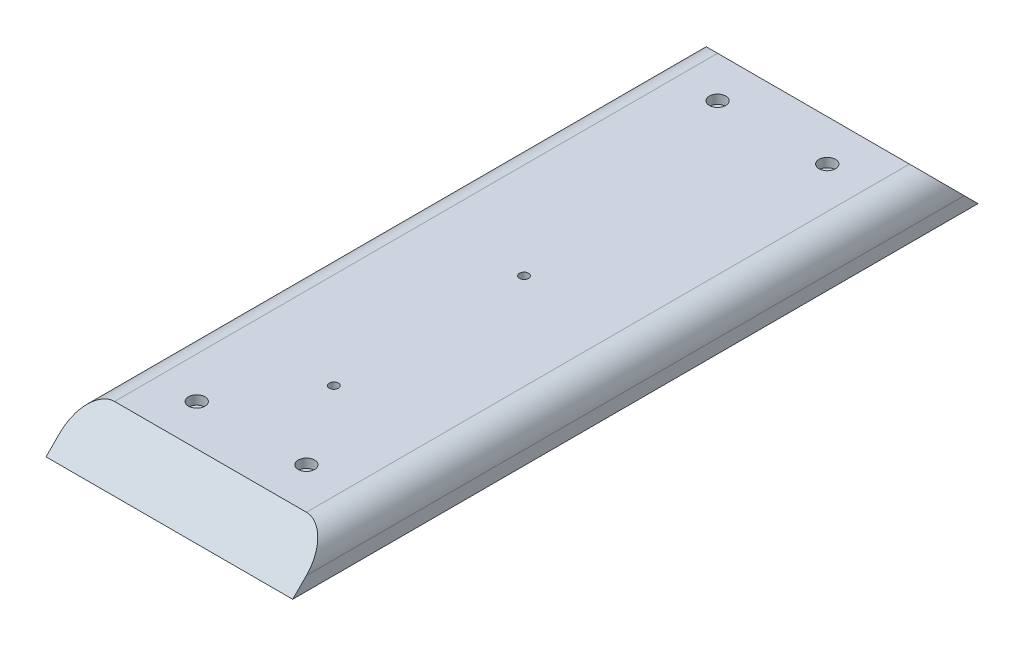
ISO-10303-21;
HEADER;
FILE_DESCRIPTION(('STEP AP214'),'2;1');
FILE_NAME('part.step','',(''),(''),'','','');
FILE_SCHEMA(('AUTOMOTIVE_DESIGN { 1 0 10303 214 1 1 1 1 }'));
ENDSEC;
DATA;
#1=APPLICATION_CONTEXT('core data for automotive mechanical design processes');
#2=APPLICATION_PROTOCOL_DEFINITION('international standard','automotive_design',2000,#1);
#3=PRODUCT_CONTEXT('',#1,'mechanical');
#4=PRODUCT('Part','Part','',(#3));
#5=PRODUCT_RELATED_PRODUCT_CATEGORY('part','',(#4));
#6=PRODUCT_DEFINITION_FORMATION('','',#4);
#7=PRODUCT_DEFINITION_CONTEXT('part definition',#1,'design');
#8=PRODUCT_DEFINITION('design','',#6,#7);
#9=PRODUCT_DEFINITION_SHAPE('','',#8);
#10=(LENGTH_UNIT() NAMED_UNIT(*) SI_UNIT(.MILLI.,.METRE.));
#11=(NAMED_UNIT(*) PLANE_ANGLE_UNIT() SI_UNIT($,.RADIAN.));
#12=(NAMED_UNIT(*) SI_UNIT($,.STERADIAN.) SOLID_ANGLE_UNIT());
#13=UNCERTAINTY_MEASURE_WITH_UNIT(LENGTH_MEASURE(1.E-05),#10,'distance_accuracy_value','');
#14=(GEOMETRIC_REPRESENTATION_CONTEXT(3) GLOBAL_UNCERTAINTY_ASSIGNED_CONTEXT((#13)) GLOBAL_UNIT_ASSIGNED_CONTEXT((#10,
#11,#12)) REPRESENTATION_CONTEXT('',''));
#15=CARTESIAN_POINT('',(0.,0.,0.));
#16=DIRECTION('',(0.,0.,1.));
#17=DIRECTION('',(1.,0.,0.));
#18=AXIS2_PLACEMENT_3D('',#15,#16,#17);
#19=CARTESIAN_POINT('',(45.,0.,-129.4));
#20=DIRECTION('',(0.,1.,0.));
#21=DIRECTION('',(0.,0.,1.));
#22=AXIS2_PLACEMENT_3D('',#19,#20,#21);
#23=CYLINDRICAL_SURFACE('',#22,1.65);
#24=CARTESIAN_POINT('',(45.,15.,-129.4));
#25=DIRECTION('',(0.,1.,0.));
#26=DIRECTION('',(0.,0.,1.));
#27=AXIS2_PLACEMENT_3D('',#24,#25,#26);
#28=CIRCLE('',#27,1.65);
#29=CARTESIAN_POINT('',(45.,15.,-127.75));
#30=VERTEX_POINT('',#29);
#31=EDGE_CURVE('E275',#30,#30,#28,.T.);
#32=ORIENTED_EDGE('',*,*,#31,.T.);
#33=EDGE_LOOP('',(#32));
#34=FACE_BOUND('',#33,.T.);
#35=CARTESIAN_POINT('',(45.,10.,-129.4));
#36=DIRECTION('',(0.,-1.,0.));
#37=DIRECTION('',(0.,0.,-1.));
#38=AXIS2_PLACEMENT_3D('',#35,#36,#37);
#39=CIRCLE('',#38,1.65);
#40=CARTESIAN_POINT('',(45.,10.,-131.05));
#41=VERTEX_POINT('',#40);
#42=EDGE_CURVE('E47',#41,#41,#39,.F.);
#43=ORIENTED_EDGE('',*,*,#42,.F.);
#44=EDGE_LOOP('',(#43));
#45=FACE_BOUND('',#44,.T.);
#46=ADVANCED_FACE('F43',(#34,#45),#23,.F.);
#47=CARTESIAN_POINT('',(45.,0.,-60.));
#48=DIRECTION('',(0.,1.,0.));
#49=DIRECTION('',(0.,0.,1.));
#50=AXIS2_PLACEMENT_3D('',#47,#48,#49);
#51=CYLINDRICAL_SURFACE('',#50,1.65);
#52=CARTESIAN_POINT('',(45.,15.,-60.));
#53=DIRECTION('',(0.,1.,0.));
#54=DIRECTION('',(0.,0.,1.));
#55=AXIS2_PLACEMENT_3D('',#52,#53,#54);
#56=CIRCLE('',#55,1.65);
#57=CARTESIAN_POINT('',(45.,15.,-58.35));
#58=VERTEX_POINT('',#57);
#59=EDGE_CURVE('E271',#58,#58,#56,.T.);
#60=ORIENTED_EDGE('',*,*,#59,.T.);
#61=EDGE_LOOP('',(#60));
#62=FACE_BOUND('',#61,.T.);
#63=CARTESIAN_POINT('',(45.,10.,-60.));
#64=DIRECTION('',(0.,-1.,0.));
#65=DIRECTION('',(0.,0.,-1.));
#66=AXIS2_PLACEMENT_3D('',#63,#64,#65);
#67=CIRCLE('',#66,1.65);
#68=CARTESIAN_POINT('',(45.,10.,-61.65));
#69=VERTEX_POINT('',#68);
#70=EDGE_CURVE('E217',#69,#69,#67,.F.);
#71=ORIENTED_EDGE('',*,*,#70,.F.);
#72=EDGE_LOOP('',(#71));
#73=FACE_BOUND('',#72,.T.);
#74=ADVANCED_FACE('F374',(#62,#73),#51,.F.);
#75=CARTESIAN_POINT('',(25.,0.,-30.));
#76=DIRECTION('',(0.,1.,0.));
#77=DIRECTION('',(0.,0.,1.));
#78=AXIS2_PLACEMENT_3D('',#75,#76,#77);
#79=CYLINDRICAL_SURFACE('',#78,1.65);
#80=CARTESIAN_POINT('',(25.,0.,-30.));
#81=DIRECTION('',(0.,1.,0.));
#82=DIRECTION('',(0.,0.,1.));
#83=AXIS2_PLACEMENT_3D('',#80,#81,#82);
#84=CIRCLE('',#83,1.65);
#85=CARTESIAN_POINT('',(25.,0.,-28.35));
#86=VERTEX_POINT('',#85);
#87=EDGE_CURVE('E305',#86,#86,#84,.T.);
#88=ORIENTED_EDGE('',*,*,#87,.F.);
#89=EDGE_LOOP('',(#88));
#90=FACE_BOUND('',#89,.T.);
#91=CARTESIAN_POINT('',(25.,11.7,-30.));
#92=DIRECTION('',(0.,1.,0.));
#93=DIRECTION('',(0.,0.,1.));
#94=AXIS2_PLACEMENT_3D('',#91,#92,#93);
#95=CIRCLE('',#94,1.65);
#96=CARTESIAN_POINT('',(25.,11.7,-28.35));
#97=VERTEX_POINT('',#96);
#98=EDGE_CURVE('E312',#97,#97,#95,.F.);
#99=ORIENTED_EDGE('',*,*,#98,.F.);
#100=EDGE_LOOP('',(#99));
#101=FACE_BOUND('',#100,.T.);
#102=ADVANCED_FACE('F381',(#90,#101),#79,.F.);
#103=CARTESIAN_POINT('',(65.,0.,-30.));
#104=DIRECTION('',(0.,1.,0.));
#105=DIRECTION('',(0.,0.,1.));
#106=AXIS2_PLACEMENT_3D('',#103,#104,#105);
#107=CYLINDRICAL_SURFACE('',#106,1.65);
#108=CARTESIAN_POINT('',(65.,0.,-30.));
#109=DIRECTION('',(0.,1.,0.));
#110=DIRECTION('',(0.,0.,1.));
#111=AXIS2_PLACEMENT_3D('',#108,#109,#110);
#112=CIRCLE('',#111,1.65);
#113=CARTESIAN_POINT('',(65.,0.,-28.35));
#114=VERTEX_POINT('',#113);
#115=EDGE_CURVE('E302',#114,#114,#112,.T.);
#116=ORIENTED_EDGE('',*,*,#115,.F.);
#117=EDGE_LOOP('',(#116));
#118=FACE_BOUND('',#117,.T.);
#119=CARTESIAN_POINT('',(65.,11.7,-30.));
#120=DIRECTION('',(0.,1.,0.));
#121=DIRECTION('',(0.,0.,1.));
#122=AXIS2_PLACEMENT_3D('',#119,#120,#121);
#123=CIRCLE('',#122,1.65);
#124=CARTESIAN_POINT('',(65.,11.7,-28.35));
#125=VERTEX_POINT('',#124);
#126=EDGE_CURVE('E362',#125,#125,#123,.F.);
#127=ORIENTED_EDGE('',*,*,#126,.F.);
#128=EDGE_LOOP('',(#127));
#129=FACE_BOUND('',#128,.T.);
#130=ADVANCED_FACE('F419',(#118,#129),#107,.F.);
#131=CARTESIAN_POINT('',(0.,15.,0.));
#132=DIRECTION('',(1.,0.,0.));
#133=DIRECTION('',(0.,0.,-1.));
#134=AXIS2_PLACEMENT_3D('',#131,#132,#133);
#135=PLANE('',#134);
#136=DIRECTION('',(0.,-0.707106781186549,0.707106781186546));
#137=VECTOR('',#136,1.);
#138=CARTESIAN_POINT('',(0.,15.,-15.));
#139=LINE('',#138,#137);
#140=CARTESIAN_POINT('',(0.,0.,0.));
#141=VERTEX_POINT('',#140);
#142=CARTESIAN_POINT('',(0.,5.,-4.99999999999999));
#143=VERTEX_POINT('',#142);
#144=EDGE_CURVE('E332',#141,#143,#139,.F.);
#145=ORIENTED_EDGE('',*,*,#144,.T.);
#146=DIRECTION('',(0.,0.,1.));
#147=VECTOR('',#146,1.);
#148=CARTESIAN_POINT('',(0.,5.,0.));
#149=LINE('',#148,#147);
#150=CARTESIAN_POINT('',(0.,5.,-245.));
#151=VERTEX_POINT('',#150);
#152=EDGE_CURVE('E352',#143,#151,#149,.F.);
#153=ORIENTED_EDGE('',*,*,#152,.T.);
#154=DIRECTION('',(0.,0.707106781186549,0.707106781186546));
#155=VECTOR('',#154,1.);
#156=CARTESIAN_POINT('',(0.,15.,-235.));
#157=LINE('',#156,#155);
#158=CARTESIAN_POINT('',(0.,0.,-250.));
#159=VERTEX_POINT('',#158);
#160=EDGE_CURVE('E335',#151,#159,#157,.F.);
#161=ORIENTED_EDGE('',*,*,#160,.T.);
#162=DIRECTION('',(0.,0.,1.));
#163=VECTOR('',#162,1.);
#164=CARTESIAN_POINT('',(0.,0.,0.));
#165=LINE('',#164,#163);
#166=EDGE_CURVE('E315',#159,#141,#165,.T.);
#167=ORIENTED_EDGE('',*,*,#166,.T.);
#168=EDGE_LOOP('',(#145,#153,#161,#167));
#169=FACE_BOUND('',#168,.T.);
#170=ADVANCED_FACE('F422',(#169),#135,.F.);
#171=CARTESIAN_POINT('',(90.,15.,0.));
#172=DIRECTION('',(-1.,0.,0.));
#173=DIRECTION('',(0.,0.,1.));
#174=AXIS2_PLACEMENT_3D('',#171,#172,#173);
#175=PLANE('',#174);
#176=DIRECTION('',(0.,-0.707106781186549,-0.707106781186546));
#177=VECTOR('',#176,1.);
#178=CARTESIAN_POINT('',(90.,15.,-235.));
#179=LINE('',#178,#177);
#180=CARTESIAN_POINT('',(90.,0.,-250.));
#181=VERTEX_POINT('',#180);
#182=CARTESIAN_POINT('',(90.,5.,-245.));
#183=VERTEX_POINT('',#182);
#184=EDGE_CURVE('E339',#181,#183,#179,.F.);
#185=ORIENTED_EDGE('',*,*,#184,.T.);
#186=DIRECTION('',(0.,0.,-1.));
#187=VECTOR('',#186,1.);
#188=CARTESIAN_POINT('',(90.,5.,0.));
#189=LINE('',#188,#187);
#190=CARTESIAN_POINT('',(90.,5.,-4.99999999999999));
#191=VERTEX_POINT('',#190);
#192=EDGE_CURVE('E11',#183,#191,#189,.F.);
#193=ORIENTED_EDGE('',*,*,#192,.T.);
#194=DIRECTION('',(0.,0.707106781186549,-0.707106781186546));
#195=VECTOR('',#194,1.);
#196=CARTESIAN_POINT('',(90.,15.,-15.));
#197=LINE('',#196,#195);
#198=CARTESIAN_POINT('',(90.,0.,0.));
#199=VERTEX_POINT('',#198);
#200=EDGE_CURVE('E337',#191,#199,#197,.F.);
#201=ORIENTED_EDGE('',*,*,#200,.T.);
#202=DIRECTION('',(0.,0.,-1.));
#203=VECTOR('',#202,1.);
#204=CARTESIAN_POINT('',(90.,0.,0.));
#205=LINE('',#204,#203);
#206=EDGE_CURVE('E321',#199,#181,#205,.T.);
#207=ORIENTED_EDGE('',*,*,#206,.T.);
#208=EDGE_LOOP('',(#185,#193,#201,#207));
#209=FACE_BOUND('',#208,.T.);
#210=ADVANCED_FACE('F437',(#209),#175,.F.);
#211=CARTESIAN_POINT('',(0.,15.,0.));
#212=DIRECTION('',(0.,-1.,0.));
#213=DIRECTION('',(0.,0.,-1.));
#214=AXIS2_PLACEMENT_3D('',#211,#212,#213);
#215=PLANE('',#214);
#216=ORIENTED_EDGE('',*,*,#59,.F.);
#217=EDGE_LOOP('',(#216));
#218=FACE_BOUND('',#217,.T.);
#219=ORIENTED_EDGE('',*,*,#31,.F.);
#220=EDGE_LOOP('',(#219));
#221=FACE_BOUND('',#220,.T.);
#222=CARTESIAN_POINT('',(25.,15.,-220.));
#223=DIRECTION('',(0.,1.,0.));
#224=DIRECTION('',(0.,0.,-1.));
#225=AXIS2_PLACEMENT_3D('',#222,#223,#224);
#226=CIRCLE('',#225,3.);
#227=CARTESIAN_POINT('',(25.,15.,-223.));
#228=VERTEX_POINT('',#227);
#229=EDGE_CURVE('E291',#228,#228,#226,.T.);
#230=ORIENTED_EDGE('',*,*,#229,.F.);
#231=EDGE_LOOP('',(#230));
#232=FACE_BOUND('',#231,.T.);
#233=CARTESIAN_POINT('',(64.9999999999999,15.,-220.));
#234=DIRECTION('',(0.,1.,0.));
#235=DIRECTION('',(0.,0.,-1.));
#236=AXIS2_PLACEMENT_3D('',#233,#234,#235);
#237=CIRCLE('',#236,3.00000000000001);
#238=CARTESIAN_POINT('',(64.9999999999999,15.,-223.));
#239=VERTEX_POINT('',#238);
#240=EDGE_CURVE('E285',#239,#239,#237,.T.);
#241=ORIENTED_EDGE('',*,*,#240,.F.);
#242=EDGE_LOOP('',(#241));
#243=FACE_BOUND('',#242,.T.);
#244=CARTESIAN_POINT('',(65.,15.,-30.));
#245=DIRECTION('',(0.,1.,0.));
#246=DIRECTION('',(0.,0.,1.));
#247=AXIS2_PLACEMENT_3D('',#244,#245,#246);
#248=CIRCLE('',#247,3.00000000000001);
#249=CARTESIAN_POINT('',(65.,15.,-27.));
#250=VERTEX_POINT('',#249);
#251=EDGE_CURVE('E278',#250,#250,#248,.T.);
#252=ORIENTED_EDGE('',*,*,#251,.F.);
#253=EDGE_LOOP('',(#252));
#254=FACE_BOUND('',#253,.T.);
#255=CARTESIAN_POINT('',(25.,15.,-30.));
#256=DIRECTION('',(0.,1.,0.));
#257=DIRECTION('',(0.,0.,1.));
#258=AXIS2_PLACEMENT_3D('',#255,#256,#257);
#259=CIRCLE('',#258,3.);
#260=CARTESIAN_POINT('',(25.,15.,-27.));
#261=VERTEX_POINT('',#260);
#262=EDGE_CURVE('E281',#261,#261,#259,.T.);
#263=ORIENTED_EDGE('',*,*,#262,.F.);
#264=EDGE_LOOP('',(#263));
#265=FACE_BOUND('',#264,.T.);
#266=DIRECTION('',(-1.,0.,0.));
#267=VECTOR('',#266,1.);
#268=CARTESIAN_POINT('',(0.,15.,-235.));
#269=LINE('',#268,#267);
#270=CARTESIAN_POINT('',(80.,15.,-235.));
#271=VERTEX_POINT('',#270);
#272=CARTESIAN_POINT('',(10.,15.,-235.));
#273=VERTEX_POINT('',#272);
#274=EDGE_CURVE('E329',#271,#273,#269,.T.);
#275=ORIENTED_EDGE('',*,*,#274,.T.);
#276=DIRECTION('',(0.,0.,1.));
#277=VECTOR('',#276,1.);
#278=CARTESIAN_POINT('',(10.,15.,0.));
#279=LINE('',#278,#277);
#280=CARTESIAN_POINT('',(10.,15.,-15.));
#281=VERTEX_POINT('',#280);
#282=EDGE_CURVE('E345',#273,#281,#279,.T.);
#283=ORIENTED_EDGE('',*,*,#282,.T.);
#284=DIRECTION('',(1.,0.,0.));
#285=VECTOR('',#284,1.);
#286=CARTESIAN_POINT('',(0.,15.,-15.));
#287=LINE('',#286,#285);
#288=CARTESIAN_POINT('',(80.,15.,-15.));
#289=VERTEX_POINT('',#288);
#290=EDGE_CURVE('E326',#281,#289,#287,.T.);
#291=ORIENTED_EDGE('',*,*,#290,.T.);
#292=DIRECTION('',(0.,0.,-1.));
#293=VECTOR('',#292,1.);
#294=CARTESIAN_POINT('',(80.,15.,0.));
#295=LINE('',#294,#293);
#296=EDGE_CURVE('E342',#289,#271,#295,.T.);
#297=ORIENTED_EDGE('',*,*,#296,.T.);
#298=EDGE_LOOP('',(#275,#283,#291,#297));
#299=FACE_BOUND('',#298,.T.);
#300=ADVANCED_FACE('F434',(#218,#221,#232,#243,#254,#265,#299),#215,.F.);
#301=CARTESIAN_POINT('',(0.,0.,0.));
#302=DIRECTION('',(0.,-1.,0.));
#303=DIRECTION('',(0.,0.,-1.));
#304=AXIS2_PLACEMENT_3D('',#301,#302,#303);
#305=PLANE('',#304);
#306=DIRECTION('',(0.499999999999999,0.,0.866025403784439));
#307=VECTOR('',#306,1.);
#308=CARTESIAN_POINT('',(46.6165807537309,0.,-62.8));
#309=LINE('',#308,#307);
#310=CARTESIAN_POINT('',(46.6165807537309,0.,-62.8));
#311=VERTEX_POINT('',#310);
#312=CARTESIAN_POINT('',(48.2331615074619,0.,-60.));
#313=VERTEX_POINT('',#312);
#314=EDGE_CURVE('E60',#311,#313,#309,.T.);
#315=ORIENTED_EDGE('',*,*,#314,.F.);
#316=DIRECTION('',(1.,0.,0.));
#317=VECTOR('',#316,1.);
#318=CARTESIAN_POINT('',(43.383419246269,0.,-62.8));
#319=LINE('',#318,#317);
#320=CARTESIAN_POINT('',(43.383419246269,0.,-62.8));
#321=VERTEX_POINT('',#320);
#322=EDGE_CURVE('E191',#321,#311,#319,.T.);
#323=ORIENTED_EDGE('',*,*,#322,.F.);
#324=DIRECTION('',(0.5,0.,-0.866025403784439));
#325=VECTOR('',#324,1.);
#326=CARTESIAN_POINT('',(41.7668384925381,0.,-60.));
#327=LINE('',#326,#325);
#328=CARTESIAN_POINT('',(41.7668384925381,0.,-60.));
#329=VERTEX_POINT('',#328);
#330=EDGE_CURVE('E194',#329,#321,#327,.T.);
#331=ORIENTED_EDGE('',*,*,#330,.F.);
#332=DIRECTION('',(-0.5,0.,-0.866025403784439));
#333=VECTOR('',#332,1.);
#334=CARTESIAN_POINT('',(43.383419246269,0.,-57.2));
#335=LINE('',#334,#333);
#336=CARTESIAN_POINT('',(43.383419246269,0.,-57.2));
#337=VERTEX_POINT('',#336);
#338=EDGE_CURVE('E210',#337,#329,#335,.T.);
#339=ORIENTED_EDGE('',*,*,#338,.F.);
#340=DIRECTION('',(-1.,0.,0.));
#341=VECTOR('',#340,1.);
#342=CARTESIAN_POINT('',(46.6165807537309,0.,-57.2));
#343=LINE('',#342,#341);
#344=CARTESIAN_POINT('',(46.6165807537309,0.,-57.2));
#345=VERTEX_POINT('',#344);
#346=EDGE_CURVE('E207',#345,#337,#343,.T.);
#347=ORIENTED_EDGE('',*,*,#346,.F.);
#348=DIRECTION('',(-0.5,0.,0.866025403784438));
#349=VECTOR('',#348,1.);
#350=CARTESIAN_POINT('',(48.2331615074619,0.,-60.));
#351=LINE('',#350,#349);
#352=EDGE_CURVE('E205',#313,#345,#351,.T.);
#353=ORIENTED_EDGE('',*,*,#352,.F.);
#354=EDGE_LOOP('',(#315,#323,#331,#339,#347,#353));
#355=FACE_BOUND('',#354,.T.);
#356=DIRECTION('',(0.499999999999998,0.,0.86602540378444));
#357=VECTOR('',#356,1.);
#358=CARTESIAN_POINT('',(46.616580753731,0.,-132.2));
#359=LINE('',#358,#357);
#360=CARTESIAN_POINT('',(46.616580753731,0.,-132.2));
#361=VERTEX_POINT('',#360);
#362=CARTESIAN_POINT('',(48.2331615074619,0.,-129.4));
#363=VERTEX_POINT('',#362);
#364=EDGE_CURVE('E68',#361,#363,#359,.T.);
#365=ORIENTED_EDGE('',*,*,#364,.F.);
#366=DIRECTION('',(1.,0.,0.));
#367=VECTOR('',#366,1.);
#368=CARTESIAN_POINT('',(43.3834192462691,0.,-132.2));
#369=LINE('',#368,#367);
#370=CARTESIAN_POINT('',(43.3834192462691,0.,-132.2));
#371=VERTEX_POINT('',#370);
#372=EDGE_CURVE('E238',#371,#361,#369,.T.);
#373=ORIENTED_EDGE('',*,*,#372,.F.);
#374=DIRECTION('',(0.500000000000001,0.,-0.866025403784438));
#375=VECTOR('',#374,1.);
#376=CARTESIAN_POINT('',(41.7668384925381,0.,-129.4));
#377=LINE('',#376,#375);
#378=CARTESIAN_POINT('',(41.7668384925381,0.,-129.4));
#379=VERTEX_POINT('',#378);
#380=EDGE_CURVE('E241',#379,#371,#377,.T.);
#381=ORIENTED_EDGE('',*,*,#380,.F.);
#382=DIRECTION('',(-0.5,0.,-0.866025403784438));
#383=VECTOR('',#382,1.);
#384=CARTESIAN_POINT('',(43.3834192462691,0.,-126.6));
#385=LINE('',#384,#383);
#386=CARTESIAN_POINT('',(43.3834192462691,0.,-126.6));
#387=VERTEX_POINT('',#386);
#388=EDGE_CURVE('E245',#387,#379,#385,.T.);
#389=ORIENTED_EDGE('',*,*,#388,.F.);
#390=DIRECTION('',(-1.,0.,0.));
#391=VECTOR('',#390,1.);
#392=CARTESIAN_POINT('',(46.616580753731,0.,-126.6));
#393=LINE('',#392,#391);
#394=CARTESIAN_POINT('',(46.616580753731,0.,-126.6));
#395=VERTEX_POINT('',#394);
#396=EDGE_CURVE('E248',#395,#387,#393,.T.);
#397=ORIENTED_EDGE('',*,*,#396,.F.);
#398=DIRECTION('',(-0.500000000000002,0.,0.866025403784437));
#399=VECTOR('',#398,1.);
#400=CARTESIAN_POINT('',(48.2331615074619,0.,-129.4));
#401=LINE('',#400,#399);
#402=EDGE_CURVE('E251',#363,#395,#401,.T.);
#403=ORIENTED_EDGE('',*,*,#402,.F.);
#404=EDGE_LOOP('',(#365,#373,#381,#389,#397,#403));
#405=FACE_BOUND('',#404,.T.);
#406=CARTESIAN_POINT('',(25.,0.,-220.));
#407=DIRECTION('',(0.,1.,0.));
#408=DIRECTION('',(0.,0.,-1.));
#409=AXIS2_PLACEMENT_3D('',#406,#407,#408);
#410=CIRCLE('',#409,1.64999999999999);
#411=CARTESIAN_POINT('',(25.,0.,-221.65));
#412=VERTEX_POINT('',#411);
#413=EDGE_CURVE('E309',#412,#412,#410,.T.);
#414=ORIENTED_EDGE('',*,*,#413,.T.);
#415=EDGE_LOOP('',(#414));
#416=FACE_BOUND('',#415,.T.);
#417=CARTESIAN_POINT('',(64.9999999999999,0.,-220.));
#418=DIRECTION('',(0.,1.,0.));
#419=DIRECTION('',(0.,0.,-1.));
#420=AXIS2_PLACEMENT_3D('',#417,#418,#419);
#421=CIRCLE('',#420,1.65);
#422=CARTESIAN_POINT('',(64.9999999999999,0.,-221.65));
#423=VERTEX_POINT('',#422);
#424=EDGE_CURVE('E306',#423,#423,#421,.T.);
#425=ORIENTED_EDGE('',*,*,#424,.T.);
#426=EDGE_LOOP('',(#425));
#427=FACE_BOUND('',#426,.T.);
#428=ORIENTED_EDGE('',*,*,#115,.T.);
#429=EDGE_LOOP('',(#428));
#430=FACE_BOUND('',#429,.T.);
#431=ORIENTED_EDGE('',*,*,#87,.T.);
#432=EDGE_LOOP('',(#431));
#433=FACE_BOUND('',#432,.T.);
#434=ORIENTED_EDGE('',*,*,#166,.F.);
#435=DIRECTION('',(-1.,0.,0.));
#436=VECTOR('',#435,1.);
#437=CARTESIAN_POINT('',(0.,0.,-250.));
#438=LINE('',#437,#436);
#439=EDGE_CURVE('E323',#181,#159,#438,.T.);
#440=ORIENTED_EDGE('',*,*,#439,.F.);
#441=ORIENTED_EDGE('',*,*,#206,.F.);
#442=DIRECTION('',(1.,0.,0.));
#443=VECTOR('',#442,1.);
#444=CARTESIAN_POINT('',(0.,0.,0.));
#445=LINE('',#444,#443);
#446=EDGE_CURVE('E318',#141,#199,#445,.T.);
#447=ORIENTED_EDGE('',*,*,#446,.F.);
#448=EDGE_LOOP('',(#434,#440,#441,#447));
#449=FACE_BOUND('',#448,.T.);
#450=ADVANCED_FACE('F436',(#355,#405,#416,#427,#430,#433,#449),#305,.T.);
#451=CARTESIAN_POINT('',(0.,15.,-235.));
#452=DIRECTION('',(0.,-0.707106781186546,0.707106781186549));
#453=DIRECTION('',(-1.,0.,0.));
#454=AXIS2_PLACEMENT_3D('',#451,#452,#453);
#455=PLANE('',#454);
#456=ORIENTED_EDGE('',*,*,#160,.F.);
#457=CARTESIAN_POINT('',(10.,5.,-245.));
#458=DIRECTION('',(0.,-0.707106781186546,0.707106781186549));
#459=DIRECTION('',(0.,0.707106781186549,0.707106781186546));
#460=AXIS2_PLACEMENT_3D('',#457,#458,#459);
#461=ELLIPSE('',#460,14.1421356237309,10.);
#462=EDGE_CURVE('E52',#151,#273,#461,.F.);
#463=ORIENTED_EDGE('',*,*,#462,.T.);
#464=ORIENTED_EDGE('',*,*,#274,.F.);
#465=CARTESIAN_POINT('',(80.,5.,-245.));
#466=DIRECTION('',(0.,-0.707106781186546,0.707106781186549));
#467=DIRECTION('',(0.,-0.707106781186549,-0.707106781186546));
#468=AXIS2_PLACEMENT_3D('',#465,#466,#467);
#469=ELLIPSE('',#468,14.1421356237309,10.);
#470=EDGE_CURVE('E354',#271,#183,#469,.F.);
#471=ORIENTED_EDGE('',*,*,#470,.T.);
#472=ORIENTED_EDGE('',*,*,#184,.F.);
#473=ORIENTED_EDGE('',*,*,#439,.T.);
#474=EDGE_LOOP('',(#456,#463,#464,#471,#472,#473));
#475=FACE_BOUND('',#474,.T.);
#476=ADVANCED_FACE('F441',(#475),#455,.F.);
#477=CARTESIAN_POINT('',(0.,15.,-15.));
#478=DIRECTION('',(0.,-0.707106781186546,-0.707106781186549));
#479=DIRECTION('',(1.,0.,0.));
#480=AXIS2_PLACEMENT_3D('',#477,#478,#479);
#481=PLANE('',#480);
#482=ORIENTED_EDGE('',*,*,#290,.F.);
#483=CARTESIAN_POINT('',(10.,5.,-4.99999999999999));
#484=DIRECTION('',(0.,-0.707106781186546,-0.707106781186549));
#485=DIRECTION('',(0.,-0.707106781186549,0.707106781186546));
#486=AXIS2_PLACEMENT_3D('',#483,#484,#485);
#487=ELLIPSE('',#486,14.1421356237309,10.);
#488=EDGE_CURVE('E350',#281,#143,#487,.F.);
#489=ORIENTED_EDGE('',*,*,#488,.T.);
#490=ORIENTED_EDGE('',*,*,#144,.F.);
#491=ORIENTED_EDGE('',*,*,#446,.T.);
#492=ORIENTED_EDGE('',*,*,#200,.F.);
#493=CARTESIAN_POINT('',(80.,5.,-4.99999999999999));
#494=DIRECTION('',(0.,-0.707106781186546,-0.707106781186549));
#495=DIRECTION('',(0.,0.707106781186549,-0.707106781186546));
#496=AXIS2_PLACEMENT_3D('',#493,#494,#495);
#497=ELLIPSE('',#496,14.1421356237309,10.);
#498=EDGE_CURVE('E348',#191,#289,#497,.F.);
#499=ORIENTED_EDGE('',*,*,#498,.T.);
#500=EDGE_LOOP('',(#482,#489,#490,#491,#492,#499));
#501=FACE_BOUND('',#500,.T.);
#502=ADVANCED_FACE('F455',(#501),#481,.F.);
#503=CARTESIAN_POINT('',(10.,5.,0.));
#504=DIRECTION('',(0.,0.,1.));
#505=DIRECTION('',(1.,0.,0.));
#506=AXIS2_PLACEMENT_3D('',#503,#504,#505);
#507=CYLINDRICAL_SURFACE('',#506,10.);
#508=ORIENTED_EDGE('',*,*,#462,.F.);
#509=ORIENTED_EDGE('',*,*,#152,.F.);
#510=ORIENTED_EDGE('',*,*,#488,.F.);
#511=ORIENTED_EDGE('',*,*,#282,.F.);
#512=EDGE_LOOP('',(#508,#509,#510,#511));
#513=FACE_BOUND('',#512,.T.);
#514=ADVANCED_FACE('F460',(#513),#507,.T.);
#515=CARTESIAN_POINT('',(80.,5.,0.));
#516=DIRECTION('',(0.,0.,-1.));
#517=DIRECTION('',(-1.,0.,0.));
#518=AXIS2_PLACEMENT_3D('',#515,#516,#517);
#519=CYLINDRICAL_SURFACE('',#518,10.);
#520=ORIENTED_EDGE('',*,*,#498,.F.);
#521=ORIENTED_EDGE('',*,*,#192,.F.);
#522=ORIENTED_EDGE('',*,*,#470,.F.);
#523=ORIENTED_EDGE('',*,*,#296,.F.);
#524=EDGE_LOOP('',(#520,#521,#522,#523));
#525=FACE_BOUND('',#524,.T.);
#526=ADVANCED_FACE('F45',(#525),#519,.T.);
#527=CARTESIAN_POINT('',(64.9999999999999,0.,-220.));
#528=DIRECTION('',(0.,1.,0.));
#529=DIRECTION('',(0.,0.,1.));
#530=AXIS2_PLACEMENT_3D('',#527,#528,#529);
#531=CYLINDRICAL_SURFACE('',#530,1.65);
#532=CARTESIAN_POINT('',(64.9999999999999,11.7,-220.));
#533=DIRECTION('',(0.,-1.,0.));
#534=DIRECTION('',(0.,0.,-1.));
#535=AXIS2_PLACEMENT_3D('',#532,#533,#534);
#536=CIRCLE('',#535,1.65);
#537=CARTESIAN_POINT('',(64.9999999999999,11.7,-221.65));
#538=VERTEX_POINT('',#537);
#539=EDGE_CURVE('E359',#538,#538,#536,.F.);
#540=ORIENTED_EDGE('',*,*,#539,.T.);
#541=EDGE_LOOP('',(#540));
#542=FACE_BOUND('',#541,.T.);
#543=ORIENTED_EDGE('',*,*,#424,.F.);
#544=EDGE_LOOP('',(#543));
#545=FACE_BOUND('',#544,.T.);
#546=ADVANCED_FACE('F424',(#542,#545),#531,.F.);
#547=CARTESIAN_POINT('',(25.,0.,-220.));
#548=DIRECTION('',(0.,1.,0.));
#549=DIRECTION('',(0.,0.,1.));
#550=AXIS2_PLACEMENT_3D('',#547,#548,#549);
#551=CYLINDRICAL_SURFACE('',#550,1.64999999999999);
#552=CARTESIAN_POINT('',(25.,11.7,-220.));
#553=DIRECTION('',(0.,-1.,0.));
#554=DIRECTION('',(0.,0.,-1.));
#555=AXIS2_PLACEMENT_3D('',#552,#553,#554);
#556=CIRCLE('',#555,1.64999999999999);
#557=CARTESIAN_POINT('',(25.,11.7,-221.65));
#558=VERTEX_POINT('',#557);
#559=EDGE_CURVE('E299',#558,#558,#556,.F.);
#560=ORIENTED_EDGE('',*,*,#559,.T.);
#561=EDGE_LOOP('',(#560));
#562=FACE_BOUND('',#561,.T.);
#563=ORIENTED_EDGE('',*,*,#413,.F.);
#564=EDGE_LOOP('',(#563));
#565=FACE_BOUND('',#564,.T.);
#566=ADVANCED_FACE('F410',(#562,#565),#551,.F.);
#567=CARTESIAN_POINT('',(25.,11.7,-220.));
#568=DIRECTION('',(0.,-1.,0.));
#569=DIRECTION('',(0.,0.,-1.));
#570=AXIS2_PLACEMENT_3D('',#567,#568,#569);
#571=PLANE('',#570);
#572=CARTESIAN_POINT('',(25.,11.7,-220.));
#573=DIRECTION('',(0.,1.,0.));
#574=DIRECTION('',(0.,0.,-1.));
#575=AXIS2_PLACEMENT_3D('',#572,#573,#574);
#576=CIRCLE('',#575,3.);
#577=CARTESIAN_POINT('',(25.,11.7,-223.));
#578=VERTEX_POINT('',#577);
#579=EDGE_CURVE('E274',#578,#578,#576,.T.);
#580=ORIENTED_EDGE('',*,*,#579,.T.);
#581=EDGE_LOOP('',(#580));
#582=FACE_BOUND('',#581,.T.);
#583=ORIENTED_EDGE('',*,*,#559,.F.);
#584=EDGE_LOOP('',(#583));
#585=FACE_BOUND('',#584,.T.);
#586=ADVANCED_FACE('F406',(#582,#585),#571,.F.);
#587=CARTESIAN_POINT('',(25.,11.7,-220.));
#588=DIRECTION('',(0.,1.,0.));
#589=DIRECTION('',(0.,0.,1.));
#590=AXIS2_PLACEMENT_3D('',#587,#588,#589);
#591=CYLINDRICAL_SURFACE('',#590,3.);
#592=ORIENTED_EDGE('',*,*,#579,.F.);
#593=EDGE_LOOP('',(#592));
#594=FACE_BOUND('',#593,.T.);
#595=ORIENTED_EDGE('',*,*,#229,.T.);
#596=EDGE_LOOP('',(#595));
#597=FACE_BOUND('',#596,.T.);
#598=ADVANCED_FACE('F402',(#594,#597),#591,.F.);
#599=CARTESIAN_POINT('',(64.9999999999999,11.7,-220.));
#600=DIRECTION('',(0.,-1.,0.));
#601=DIRECTION('',(0.,0.,-1.));
#602=AXIS2_PLACEMENT_3D('',#599,#600,#601);
#603=PLANE('',#602);
#604=CARTESIAN_POINT('',(64.9999999999999,11.7,-220.));
#605=DIRECTION('',(0.,1.,0.));
#606=DIRECTION('',(0.,0.,-1.));
#607=AXIS2_PLACEMENT_3D('',#604,#605,#606);
#608=CIRCLE('',#607,3.00000000000001);
#609=CARTESIAN_POINT('',(64.9999999999999,11.7,-223.));
#610=VERTEX_POINT('',#609);
#611=EDGE_CURVE('E288',#610,#610,#608,.T.);
#612=ORIENTED_EDGE('',*,*,#611,.T.);
#613=EDGE_LOOP('',(#612));
#614=FACE_BOUND('',#613,.T.);
#615=ORIENTED_EDGE('',*,*,#539,.F.);
#616=EDGE_LOOP('',(#615));
#617=FACE_BOUND('',#616,.T.);
#618=ADVANCED_FACE('F398',(#614,#617),#603,.F.);
#619=CARTESIAN_POINT('',(64.9999999999999,11.7,-220.));
#620=DIRECTION('',(0.,1.,0.));
#621=DIRECTION('',(0.,0.,1.));
#622=AXIS2_PLACEMENT_3D('',#619,#620,#621);
#623=CYLINDRICAL_SURFACE('',#622,3.00000000000001);
#624=ORIENTED_EDGE('',*,*,#611,.F.);
#625=EDGE_LOOP('',(#624));
#626=FACE_BOUND('',#625,.T.);
#627=ORIENTED_EDGE('',*,*,#240,.T.);
#628=EDGE_LOOP('',(#627));
#629=FACE_BOUND('',#628,.T.);
#630=ADVANCED_FACE('F394',(#626,#629),#623,.F.);
#631=CARTESIAN_POINT('',(65.,11.7,-30.));
#632=DIRECTION('',(0.,1.,0.));
#633=DIRECTION('',(0.,0.,1.));
#634=AXIS2_PLACEMENT_3D('',#631,#632,#633);
#635=PLANE('',#634);
#636=CARTESIAN_POINT('',(65.,11.7,-30.));
#637=DIRECTION('',(0.,1.,0.));
#638=DIRECTION('',(0.,0.,1.));
#639=AXIS2_PLACEMENT_3D('',#636,#637,#638);
#640=CIRCLE('',#639,3.00000000000001);
#641=CARTESIAN_POINT('',(65.,11.7,-27.));
#642=VERTEX_POINT('',#641);
#643=EDGE_CURVE('E282',#642,#642,#640,.T.);
#644=ORIENTED_EDGE('',*,*,#643,.T.);
#645=EDGE_LOOP('',(#644));
#646=FACE_BOUND('',#645,.T.);
#647=ORIENTED_EDGE('',*,*,#126,.T.);
#648=EDGE_LOOP('',(#647));
#649=FACE_BOUND('',#648,.T.);
#650=ADVANCED_FACE('F390',(#646,#649),#635,.T.);
#651=CARTESIAN_POINT('',(65.,11.7,-30.));
#652=DIRECTION('',(0.,1.,0.));
#653=DIRECTION('',(0.,0.,1.));
#654=AXIS2_PLACEMENT_3D('',#651,#652,#653);
#655=CYLINDRICAL_SURFACE('',#654,3.00000000000001);
#656=ORIENTED_EDGE('',*,*,#643,.F.);
#657=EDGE_LOOP('',(#656));
#658=FACE_BOUND('',#657,.T.);
#659=ORIENTED_EDGE('',*,*,#251,.T.);
#660=EDGE_LOOP('',(#659));
#661=FACE_BOUND('',#660,.T.);
#662=ADVANCED_FACE('F386',(#658,#661),#655,.F.);
#663=CARTESIAN_POINT('',(25.,11.7,-30.));
#664=DIRECTION('',(0.,1.,0.));
#665=DIRECTION('',(0.,0.,1.));
#666=AXIS2_PLACEMENT_3D('',#663,#664,#665);
#667=PLANE('',#666);
#668=CARTESIAN_POINT('',(25.,11.7,-30.));
#669=DIRECTION('',(0.,1.,0.));
#670=DIRECTION('',(0.,0.,1.));
#671=AXIS2_PLACEMENT_3D('',#668,#669,#670);
#672=CIRCLE('',#671,3.);
#673=CARTESIAN_POINT('',(25.,11.7,-27.));
#674=VERTEX_POINT('',#673);
#675=EDGE_CURVE('E296',#674,#674,#672,.T.);
#676=ORIENTED_EDGE('',*,*,#675,.T.);
#677=EDGE_LOOP('',(#676));
#678=FACE_BOUND('',#677,.T.);
#679=ORIENTED_EDGE('',*,*,#98,.T.);
#680=EDGE_LOOP('',(#679));
#681=FACE_BOUND('',#680,.T.);
#682=ADVANCED_FACE('F389',(#678,#681),#667,.T.);
#683=CARTESIAN_POINT('',(25.,11.7,-30.));
#684=DIRECTION('',(0.,1.,0.));
#685=DIRECTION('',(0.,0.,1.));
#686=AXIS2_PLACEMENT_3D('',#683,#684,#685);
#687=CYLINDRICAL_SURFACE('',#686,3.);
#688=ORIENTED_EDGE('',*,*,#675,.F.);
#689=EDGE_LOOP('',(#688));
#690=FACE_BOUND('',#689,.T.);
#691=ORIENTED_EDGE('',*,*,#262,.T.);
#692=EDGE_LOOP('',(#691));
#693=FACE_BOUND('',#692,.T.);
#694=ADVANCED_FACE('F414',(#690,#693),#687,.F.);
#695=CARTESIAN_POINT('',(0.,10.,0.));
#696=DIRECTION('',(0.,-1.,0.));
#697=DIRECTION('',(0.,0.,-1.));
#698=AXIS2_PLACEMENT_3D('',#695,#696,#697);
#699=PLANE('',#698);
#700=DIRECTION('',(0.499999999999999,0.,0.866025403784439));
#701=VECTOR('',#700,1.);
#702=CARTESIAN_POINT('',(46.6165807537309,10.,-62.8));
#703=LINE('',#702,#701);
#704=CARTESIAN_POINT('',(46.6165807537309,10.,-62.8));
#705=VERTEX_POINT('',#704);
#706=CARTESIAN_POINT('',(48.2331615074619,10.,-60.));
#707=VERTEX_POINT('',#706);
#708=EDGE_CURVE('E171',#705,#707,#703,.T.);
#709=ORIENTED_EDGE('',*,*,#708,.T.);
#710=DIRECTION('',(-0.5,0.,0.866025403784438));
#711=VECTOR('',#710,1.);
#712=CARTESIAN_POINT('',(48.2331615074619,10.,-60.));
#713=LINE('',#712,#711);
#714=CARTESIAN_POINT('',(46.6165807537309,10.,-57.2));
#715=VERTEX_POINT('',#714);
#716=EDGE_CURVE('E180',#707,#715,#713,.T.);
#717=ORIENTED_EDGE('',*,*,#716,.T.);
#718=DIRECTION('',(-1.,0.,0.));
#719=VECTOR('',#718,1.);
#720=CARTESIAN_POINT('',(46.6165807537309,10.,-57.2));
#721=LINE('',#720,#719);
#722=CARTESIAN_POINT('',(43.383419246269,10.,-57.2));
#723=VERTEX_POINT('',#722);
#724=EDGE_CURVE('E185',#715,#723,#721,.T.);
#725=ORIENTED_EDGE('',*,*,#724,.T.);
#726=DIRECTION('',(-0.5,0.,-0.866025403784439));
#727=VECTOR('',#726,1.);
#728=CARTESIAN_POINT('',(43.383419246269,10.,-57.2));
#729=LINE('',#728,#727);
#730=CARTESIAN_POINT('',(41.7668384925381,10.,-60.));
#731=VERTEX_POINT('',#730);
#732=EDGE_CURVE('E198',#723,#731,#729,.T.);
#733=ORIENTED_EDGE('',*,*,#732,.T.);
#734=DIRECTION('',(0.5,0.,-0.866025403784439));
#735=VECTOR('',#734,1.);
#736=CARTESIAN_POINT('',(41.7668384925381,10.,-60.));
#737=LINE('',#736,#735);
#738=CARTESIAN_POINT('',(43.383419246269,10.,-62.8));
#739=VERTEX_POINT('',#738);
#740=EDGE_CURVE('E201',#731,#739,#737,.T.);
#741=ORIENTED_EDGE('',*,*,#740,.T.);
#742=DIRECTION('',(1.,0.,0.));
#743=VECTOR('',#742,1.);
#744=CARTESIAN_POINT('',(43.383419246269,10.,-62.8));
#745=LINE('',#744,#743);
#746=EDGE_CURVE('E177',#739,#705,#745,.T.);
#747=ORIENTED_EDGE('',*,*,#746,.T.);
#748=EDGE_LOOP('',(#709,#717,#725,#733,#741,#747));
#749=FACE_BOUND('',#748,.T.);
#750=ORIENTED_EDGE('',*,*,#70,.T.);
#751=EDGE_LOOP('',(#750));
#752=FACE_BOUND('',#751,.T.);
#753=ADVANCED_FACE('F187',(#749,#752),#699,.T.);
#754=CARTESIAN_POINT('',(46.6165807537309,10.,-62.8));
#755=DIRECTION('',(0.866025403784439,0.,-0.499999999999999));
#756=DIRECTION('',(-0.499999999999999,0.,-0.866025403784439));
#757=AXIS2_PLACEMENT_3D('',#754,#755,#756);
#758=PLANE('',#757);
#759=ORIENTED_EDGE('',*,*,#314,.T.);
#760=DIRECTION('',(0.,-1.,0.));
#761=VECTOR('',#760,1.);
#762=CARTESIAN_POINT('',(48.2331615074619,10.,-60.));
#763=LINE('',#762,#761);
#764=EDGE_CURVE('E167',#707,#313,#763,.T.);
#765=ORIENTED_EDGE('',*,*,#764,.F.);
#766=ORIENTED_EDGE('',*,*,#708,.F.);
#767=DIRECTION('',(0.,-1.,0.));
#768=VECTOR('',#767,1.);
#769=CARTESIAN_POINT('',(46.6165807537309,10.,-62.8));
#770=LINE('',#769,#768);
#771=EDGE_CURVE('E215',#705,#311,#770,.T.);
#772=ORIENTED_EDGE('',*,*,#771,.T.);
#773=EDGE_LOOP('',(#759,#765,#766,#772));
#774=FACE_BOUND('',#773,.T.);
#775=ADVANCED_FACE('F169',(#774),#758,.F.);
#776=CARTESIAN_POINT('',(43.383419246269,10.,-62.8));
#777=DIRECTION('',(0.,0.,-1.));
#778=DIRECTION('',(-1.,0.,0.));
#779=AXIS2_PLACEMENT_3D('',#776,#777,#778);
#780=PLANE('',#779);
#781=ORIENTED_EDGE('',*,*,#322,.T.);
#782=ORIENTED_EDGE('',*,*,#771,.F.);
#783=ORIENTED_EDGE('',*,*,#746,.F.);
#784=DIRECTION('',(0.,-1.,0.));
#785=VECTOR('',#784,1.);
#786=CARTESIAN_POINT('',(43.383419246269,10.,-62.8));
#787=LINE('',#786,#785);
#788=EDGE_CURVE('E218',#739,#321,#787,.T.);
#789=ORIENTED_EDGE('',*,*,#788,.T.);
#790=EDGE_LOOP('',(#781,#782,#783,#789));
#791=FACE_BOUND('',#790,.T.);
#792=ADVANCED_FACE('F606',(#791),#780,.F.);
#793=CARTESIAN_POINT('',(41.7668384925381,10.,-60.));
#794=DIRECTION('',(-0.866025403784439,0.,-0.5));
#795=DIRECTION('',(-0.5,0.,0.866025403784439));
#796=AXIS2_PLACEMENT_3D('',#793,#794,#795);
#797=PLANE('',#796);
#798=ORIENTED_EDGE('',*,*,#330,.T.);
#799=ORIENTED_EDGE('',*,*,#788,.F.);
#800=ORIENTED_EDGE('',*,*,#740,.F.);
#801=DIRECTION('',(0.,-1.,0.));
#802=VECTOR('',#801,1.);
#803=CARTESIAN_POINT('',(41.7668384925381,10.,-60.));
#804=LINE('',#803,#802);
#805=EDGE_CURVE('E220',#731,#329,#804,.T.);
#806=ORIENTED_EDGE('',*,*,#805,.T.);
#807=EDGE_LOOP('',(#798,#799,#800,#806));
#808=FACE_BOUND('',#807,.T.);
#809=ADVANCED_FACE('F614',(#808),#797,.F.);
#810=CARTESIAN_POINT('',(43.383419246269,10.,-57.2));
#811=DIRECTION('',(-0.866025403784439,0.,0.5));
#812=DIRECTION('',(0.5,0.,0.866025403784439));
#813=AXIS2_PLACEMENT_3D('',#810,#811,#812);
#814=PLANE('',#813);
#815=ORIENTED_EDGE('',*,*,#338,.T.);
#816=ORIENTED_EDGE('',*,*,#805,.F.);
#817=ORIENTED_EDGE('',*,*,#732,.F.);
#818=DIRECTION('',(0.,-1.,0.));
#819=VECTOR('',#818,1.);
#820=CARTESIAN_POINT('',(43.383419246269,10.,-57.2));
#821=LINE('',#820,#819);
#822=EDGE_CURVE('E222',#723,#337,#821,.T.);
#823=ORIENTED_EDGE('',*,*,#822,.T.);
#824=EDGE_LOOP('',(#815,#816,#817,#823));
#825=FACE_BOUND('',#824,.T.);
#826=ADVANCED_FACE('F623',(#825),#814,.F.);
#827=CARTESIAN_POINT('',(46.6165807537309,10.,-57.2));
#828=DIRECTION('',(0.,0.,1.));
#829=DIRECTION('',(1.,0.,0.));
#830=AXIS2_PLACEMENT_3D('',#827,#828,#829);
#831=PLANE('',#830);
#832=ORIENTED_EDGE('',*,*,#346,.T.);
#833=ORIENTED_EDGE('',*,*,#822,.F.);
#834=ORIENTED_EDGE('',*,*,#724,.F.);
#835=DIRECTION('',(0.,-1.,0.));
#836=VECTOR('',#835,1.);
#837=CARTESIAN_POINT('',(46.6165807537309,10.,-57.2));
#838=LINE('',#837,#836);
#839=EDGE_CURVE('E176',#715,#345,#838,.T.);
#840=ORIENTED_EDGE('',*,*,#839,.T.);
#841=EDGE_LOOP('',(#832,#833,#834,#840));
#842=FACE_BOUND('',#841,.T.);
#843=ADVANCED_FACE('F632',(#842),#831,.F.);
#844=CARTESIAN_POINT('',(48.2331615074619,10.,-60.));
#845=DIRECTION('',(0.866025403784438,0.,0.5));
#846=DIRECTION('',(0.5,0.,-0.866025403784438));
#847=AXIS2_PLACEMENT_3D('',#844,#845,#846);
#848=PLANE('',#847);
#849=ORIENTED_EDGE('',*,*,#352,.T.);
#850=ORIENTED_EDGE('',*,*,#839,.F.);
#851=ORIENTED_EDGE('',*,*,#716,.F.);
#852=ORIENTED_EDGE('',*,*,#764,.T.);
#853=EDGE_LOOP('',(#849,#850,#851,#852));
#854=FACE_BOUND('',#853,.T.);
#855=ADVANCED_FACE('F181',(#854),#848,.F.);
#856=CARTESIAN_POINT('',(0.,10.,0.));
#857=DIRECTION('',(0.,-1.,0.));
#858=DIRECTION('',(0.,0.,-1.));
#859=AXIS2_PLACEMENT_3D('',#856,#857,#858);
#860=PLANE('',#859);
#861=DIRECTION('',(0.499999999999998,0.,0.86602540378444));
#862=VECTOR('',#861,1.);
#863=CARTESIAN_POINT('',(46.616580753731,10.,-132.2));
#864=LINE('',#863,#862);
#865=CARTESIAN_POINT('',(46.616580753731,10.,-132.2));
#866=VERTEX_POINT('',#865);
#867=CARTESIAN_POINT('',(48.2331615074619,10.,-129.4));
#868=VERTEX_POINT('',#867);
#869=EDGE_CURVE('E242',#866,#868,#864,.T.);
#870=ORIENTED_EDGE('',*,*,#869,.T.);
#871=DIRECTION('',(-0.500000000000002,0.,0.866025403784437));
#872=VECTOR('',#871,1.);
#873=CARTESIAN_POINT('',(48.2331615074619,10.,-129.4));
#874=LINE('',#873,#872);
#875=CARTESIAN_POINT('',(46.616580753731,10.,-126.6));
#876=VERTEX_POINT('',#875);
#877=EDGE_CURVE('E266',#868,#876,#874,.T.);
#878=ORIENTED_EDGE('',*,*,#877,.T.);
#879=DIRECTION('',(-1.,0.,0.));
#880=VECTOR('',#879,1.);
#881=CARTESIAN_POINT('',(46.616580753731,10.,-126.6));
#882=LINE('',#881,#880);
#883=CARTESIAN_POINT('',(43.3834192462691,10.,-126.6));
#884=VERTEX_POINT('',#883);
#885=EDGE_CURVE('E263',#876,#884,#882,.T.);
#886=ORIENTED_EDGE('',*,*,#885,.T.);
#887=DIRECTION('',(-0.5,0.,-0.866025403784438));
#888=VECTOR('',#887,1.);
#889=CARTESIAN_POINT('',(43.3834192462691,10.,-126.6));
#890=LINE('',#889,#888);
#891=CARTESIAN_POINT('',(41.7668384925381,10.,-129.4));
#892=VERTEX_POINT('',#891);
#893=EDGE_CURVE('E260',#884,#892,#890,.T.);
#894=ORIENTED_EDGE('',*,*,#893,.T.);
#895=DIRECTION('',(0.500000000000001,0.,-0.866025403784438));
#896=VECTOR('',#895,1.);
#897=CARTESIAN_POINT('',(41.7668384925381,10.,-129.4));
#898=LINE('',#897,#896);
#899=CARTESIAN_POINT('',(43.3834192462691,10.,-132.2));
#900=VERTEX_POINT('',#899);
#901=EDGE_CURVE('E257',#892,#900,#898,.T.);
#902=ORIENTED_EDGE('',*,*,#901,.T.);
#903=DIRECTION('',(1.,0.,0.));
#904=VECTOR('',#903,1.);
#905=CARTESIAN_POINT('',(43.3834192462691,10.,-132.2));
#906=LINE('',#905,#904);
#907=EDGE_CURVE('E227',#900,#866,#906,.T.);
#908=ORIENTED_EDGE('',*,*,#907,.T.);
#909=EDGE_LOOP('',(#870,#878,#886,#894,#902,#908));
#910=FACE_BOUND('',#909,.T.);
#911=ORIENTED_EDGE('',*,*,#42,.T.);
#912=EDGE_LOOP('',(#911));
#913=FACE_BOUND('',#912,.T.);
#914=ADVANCED_FACE('F371',(#910,#913),#860,.T.);
#915=CARTESIAN_POINT('',(46.616580753731,10.,-132.2));
#916=DIRECTION('',(0.86602540378444,0.,-0.499999999999998));
#917=DIRECTION('',(-0.499999999999998,0.,-0.86602540378444));
#918=AXIS2_PLACEMENT_3D('',#915,#916,#917);
#919=PLANE('',#918);
#920=ORIENTED_EDGE('',*,*,#364,.T.);
#921=DIRECTION('',(0.,-1.,0.));
#922=VECTOR('',#921,1.);
#923=CARTESIAN_POINT('',(48.2331615074619,10.,-129.4));
#924=LINE('',#923,#922);
#925=EDGE_CURVE('E225',#868,#363,#924,.T.);
#926=ORIENTED_EDGE('',*,*,#925,.F.);
#927=ORIENTED_EDGE('',*,*,#869,.F.);
#928=DIRECTION('',(0.,-1.,0.));
#929=VECTOR('',#928,1.);
#930=CARTESIAN_POINT('',(46.616580753731,10.,-132.2));
#931=LINE('',#930,#929);
#932=EDGE_CURVE('E236',#866,#361,#931,.T.);
#933=ORIENTED_EDGE('',*,*,#932,.T.);
#934=EDGE_LOOP('',(#920,#926,#927,#933));
#935=FACE_BOUND('',#934,.T.);
#936=ADVANCED_FACE('F656',(#935),#919,.F.);
#937=CARTESIAN_POINT('',(43.3834192462691,10.,-132.2));
#938=DIRECTION('',(0.,0.,-1.));
#939=DIRECTION('',(-1.,0.,0.));
#940=AXIS2_PLACEMENT_3D('',#937,#938,#939);
#941=PLANE('',#940);
#942=ORIENTED_EDGE('',*,*,#372,.T.);
#943=ORIENTED_EDGE('',*,*,#932,.F.);
#944=ORIENTED_EDGE('',*,*,#907,.F.);
#945=DIRECTION('',(0.,-1.,0.));
#946=VECTOR('',#945,1.);
#947=CARTESIAN_POINT('',(43.3834192462691,10.,-132.2));
#948=LINE('',#947,#946);
#949=EDGE_CURVE('E234',#900,#371,#948,.T.);
#950=ORIENTED_EDGE('',*,*,#949,.T.);
#951=EDGE_LOOP('',(#942,#943,#944,#950));
#952=FACE_BOUND('',#951,.T.);
#953=ADVANCED_FACE('F664',(#952),#941,.F.);
#954=CARTESIAN_POINT('',(41.7668384925381,10.,-129.4));
#955=DIRECTION('',(-0.866025403784438,0.,-0.500000000000001));
#956=DIRECTION('',(-0.500000000000001,0.,0.866025403784438));
#957=AXIS2_PLACEMENT_3D('',#954,#955,#956);
#958=PLANE('',#957);
#959=ORIENTED_EDGE('',*,*,#380,.T.);
#960=ORIENTED_EDGE('',*,*,#949,.F.);
#961=ORIENTED_EDGE('',*,*,#901,.F.);
#962=DIRECTION('',(0.,-1.,0.));
#963=VECTOR('',#962,1.);
#964=CARTESIAN_POINT('',(41.7668384925381,10.,-129.4));
#965=LINE('',#964,#963);
#966=EDGE_CURVE('E232',#892,#379,#965,.T.);
#967=ORIENTED_EDGE('',*,*,#966,.T.);
#968=EDGE_LOOP('',(#959,#960,#961,#967));
#969=FACE_BOUND('',#968,.T.);
#970=ADVANCED_FACE('F672',(#969),#958,.F.);
#971=CARTESIAN_POINT('',(43.3834192462691,10.,-126.6));
#972=DIRECTION('',(-0.866025403784438,0.,0.5));
#973=DIRECTION('',(0.5,0.,0.866025403784438));
#974=AXIS2_PLACEMENT_3D('',#971,#972,#973);
#975=PLANE('',#974);
#976=ORIENTED_EDGE('',*,*,#388,.T.);
#977=ORIENTED_EDGE('',*,*,#966,.F.);
#978=ORIENTED_EDGE('',*,*,#893,.F.);
#979=DIRECTION('',(0.,-1.,0.));
#980=VECTOR('',#979,1.);
#981=CARTESIAN_POINT('',(43.3834192462691,10.,-126.6));
#982=LINE('',#981,#980);
#983=EDGE_CURVE('E230',#884,#387,#982,.T.);
#984=ORIENTED_EDGE('',*,*,#983,.T.);
#985=EDGE_LOOP('',(#976,#977,#978,#984));
#986=FACE_BOUND('',#985,.T.);
#987=ADVANCED_FACE('F681',(#986),#975,.F.);
#988=CARTESIAN_POINT('',(46.616580753731,10.,-126.6));
#989=DIRECTION('',(0.,0.,1.));
#990=DIRECTION('',(1.,0.,0.));
#991=AXIS2_PLACEMENT_3D('',#988,#989,#990);
#992=PLANE('',#991);
#993=ORIENTED_EDGE('',*,*,#396,.T.);
#994=ORIENTED_EDGE('',*,*,#983,.F.);
#995=ORIENTED_EDGE('',*,*,#885,.F.);
#996=DIRECTION('',(0.,-1.,0.));
#997=VECTOR('',#996,1.);
#998=CARTESIAN_POINT('',(46.616580753731,10.,-126.6));
#999=LINE('',#998,#997);
#1000=EDGE_CURVE('E228',#876,#395,#999,.T.);
#1001=ORIENTED_EDGE('',*,*,#1000,.T.);
#1002=EDGE_LOOP('',(#993,#994,#995,#1001));
#1003=FACE_BOUND('',#1002,.T.);
#1004=ADVANCED_FACE('F690',(#1003),#992,.F.);
#1005=CARTESIAN_POINT('',(48.2331615074619,10.,-129.4));
#1006=DIRECTION('',(0.866025403784437,0.,0.500000000000002));
#1007=DIRECTION('',(0.500000000000002,0.,-0.866025403784437));
#1008=AXIS2_PLACEMENT_3D('',#1005,#1006,#1007);
#1009=PLANE('',#1008);
#1010=ORIENTED_EDGE('',*,*,#402,.T.);
#1011=ORIENTED_EDGE('',*,*,#1000,.F.);
#1012=ORIENTED_EDGE('',*,*,#877,.F.);
#1013=ORIENTED_EDGE('',*,*,#925,.T.);
#1014=EDGE_LOOP('',(#1010,#1011,#1012,#1013));
#1015=FACE_BOUND('',#1014,.T.);
#1016=ADVANCED_FACE('F699',(#1015),#1009,.F.);
#1017=CLOSED_SHELL('',(#46,#74,#102,#130,#170,#210,#300,#450,#476,#502,#514,#526,#546,#566,#586,
#598,#618,#630,#650,#662,#682,#694,#753,#775,#792,#809,#826,#843,#855,#914,#936,#953,#970,#987,
#1004,#1016));
#1018=MANIFOLD_SOLID_BREP('B2',#1017);
#1019=ADVANCED_BREP_SHAPE_REPRESENTATION('',(#18,#1018),#14);
#1020=SHAPE_DEFINITION_REPRESENTATION(#9,#1019);
ENDSEC;
END-ISO-10303-21;
